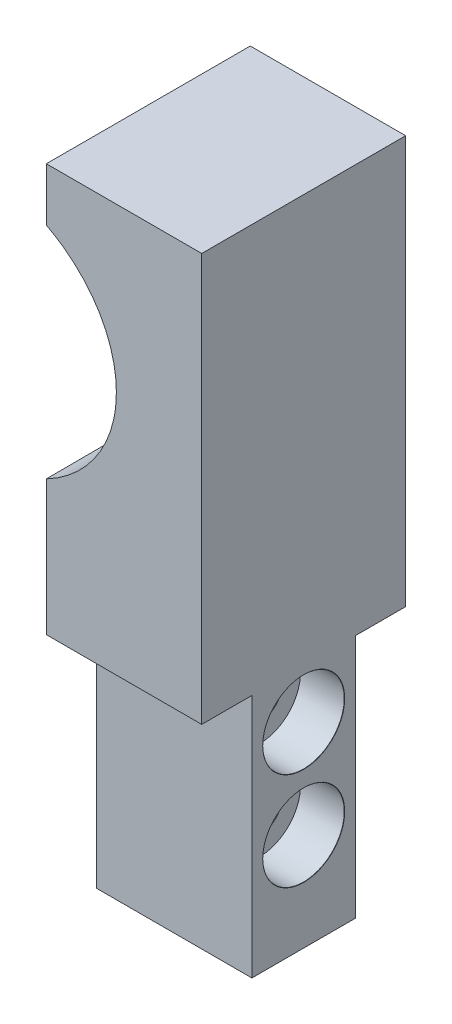
ISO-10303-21;
HEADER;
FILE_DESCRIPTION(('STEP AP214'),'2;1');
FILE_NAME('part.step','',(''),(''),'','','');
FILE_SCHEMA(('AUTOMOTIVE_DESIGN { 1 0 10303 214 1 1 1 1 }'));
ENDSEC;
DATA;
#1=APPLICATION_CONTEXT('core data for automotive mechanical design processes');
#2=APPLICATION_PROTOCOL_DEFINITION('international standard','automotive_design',2000,#1);
#3=PRODUCT_CONTEXT('',#1,'mechanical');
#4=PRODUCT('Part','Part','',(#3));
#5=PRODUCT_RELATED_PRODUCT_CATEGORY('part','',(#4));
#6=PRODUCT_DEFINITION_FORMATION('','',#4);
#7=PRODUCT_DEFINITION_CONTEXT('part definition',#1,'design');
#8=PRODUCT_DEFINITION('design','',#6,#7);
#9=PRODUCT_DEFINITION_SHAPE('','',#8);
#10=(LENGTH_UNIT() NAMED_UNIT(*) SI_UNIT(.MILLI.,.METRE.));
#11=(NAMED_UNIT(*) PLANE_ANGLE_UNIT() SI_UNIT($,.RADIAN.));
#12=(NAMED_UNIT(*) SI_UNIT($,.STERADIAN.) SOLID_ANGLE_UNIT());
#13=UNCERTAINTY_MEASURE_WITH_UNIT(LENGTH_MEASURE(1.E-05),#10,'distance_accuracy_value','');
#14=(GEOMETRIC_REPRESENTATION_CONTEXT(3) GLOBAL_UNCERTAINTY_ASSIGNED_CONTEXT((#13)) GLOBAL_UNIT_ASSIGNED_CONTEXT((#10,
#11,#12)) REPRESENTATION_CONTEXT('',''));
#15=CARTESIAN_POINT('',(0.,0.,0.));
#16=DIRECTION('',(0.,0.,1.));
#17=DIRECTION('',(1.,0.,0.));
#18=AXIS2_PLACEMENT_3D('',#15,#16,#17);
#19=CARTESIAN_POINT('',(-9.525,-40.,-12.5));
#20=DIRECTION('',(1.,0.,0.));
#21=DIRECTION('',(0.,0.,1.));
#22=AXIS2_PLACEMENT_3D('',#19,#20,#21);
#23=PLANE('',#22);
#24=CARTESIAN_POINT('',(-9.525,-28.0000000000013,0.));
#25=DIRECTION('',(-1.,0.,0.));
#26=DIRECTION('',(0.,0.,1.));
#27=AXIS2_PLACEMENT_3D('',#24,#25,#26);
#28=CIRCLE('',#27,2.775);
#29=CARTESIAN_POINT('',(-9.525,-28.0000000000013,2.775));
#30=VERTEX_POINT('',#29);
#31=EDGE_CURVE('E307',#30,#30,#28,.T.);
#32=ORIENTED_EDGE('',*,*,#31,.F.);
#33=EDGE_LOOP('',(#32));
#34=FACE_BOUND('',#33,.T.);
#35=CARTESIAN_POINT('',(-9.525,-16.000000000001,0.));
#36=DIRECTION('',(-1.,0.,0.));
#37=DIRECTION('',(0.,0.,1.));
#38=AXIS2_PLACEMENT_3D('',#35,#36,#37);
#39=CIRCLE('',#38,2.775);
#40=CARTESIAN_POINT('',(-9.525,-16.000000000001,2.775));
#41=VERTEX_POINT('',#40);
#42=EDGE_CURVE('E322',#41,#41,#39,.T.);
#43=ORIENTED_EDGE('',*,*,#42,.F.);
#44=EDGE_LOOP('',(#43));
#45=FACE_BOUND('',#44,.T.);
#46=DIRECTION('',(0.,0.,1.));
#47=VECTOR('',#46,1.);
#48=CARTESIAN_POINT('',(-9.525,-10.,-12.5));
#49=LINE('',#48,#47);
#50=CARTESIAN_POINT('',(-9.52499999999999,-10.,-12.5));
#51=VERTEX_POINT('',#50);
#52=CARTESIAN_POINT('',(-9.52499999999999,-10.,-6.35));
#53=VERTEX_POINT('',#52);
#54=EDGE_CURVE('E203',#51,#53,#49,.T.);
#55=ORIENTED_EDGE('',*,*,#54,.T.);
#56=DIRECTION('',(0.,-1.,0.));
#57=VECTOR('',#56,1.);
#58=CARTESIAN_POINT('',(-9.525,-40.,-6.35));
#59=LINE('',#58,#57);
#60=CARTESIAN_POINT('',(-9.52499999999999,-40.,-6.35));
#61=VERTEX_POINT('',#60);
#62=EDGE_CURVE('E209',#53,#61,#59,.T.);
#63=ORIENTED_EDGE('',*,*,#62,.T.);
#64=DIRECTION('',(0.,0.,1.));
#65=VECTOR('',#64,1.);
#66=CARTESIAN_POINT('',(-9.525,-40.,-12.5));
#67=LINE('',#66,#65);
#68=CARTESIAN_POINT('',(-9.525,-40.,6.35));
#69=VERTEX_POINT('',#68);
#70=EDGE_CURVE('E155',#61,#69,#67,.T.);
#71=ORIENTED_EDGE('',*,*,#70,.T.);
#72=DIRECTION('',(0.,1.,0.));
#73=VECTOR('',#72,1.);
#74=CARTESIAN_POINT('',(-9.525,-40.,6.35));
#75=LINE('',#74,#73);
#76=CARTESIAN_POINT('',(-9.525,-10.,6.35));
#77=VERTEX_POINT('',#76);
#78=EDGE_CURVE('E206',#69,#77,#75,.T.);
#79=ORIENTED_EDGE('',*,*,#78,.T.);
#80=DIRECTION('',(0.,0.,1.));
#81=VECTOR('',#80,1.);
#82=CARTESIAN_POINT('',(-9.525,-10.,-12.5));
#83=LINE('',#82,#81);
#84=CARTESIAN_POINT('',(-9.525,-10.,12.5));
#85=VERTEX_POINT('',#84);
#86=EDGE_CURVE('E132',#77,#85,#83,.T.);
#87=ORIENTED_EDGE('',*,*,#86,.T.);
#88=DIRECTION('',(0.,-1.,0.));
#89=VECTOR('',#88,1.);
#90=CARTESIAN_POINT('',(-9.525,-40.,12.5));
#91=LINE('',#90,#89);
#92=CARTESIAN_POINT('',(-9.525,6.54099273428371,12.5));
#93=VERTEX_POINT('',#92);
#94=EDGE_CURVE('E122',#93,#85,#91,.T.);
#95=ORIENTED_EDGE('',*,*,#94,.F.);
#96=CARTESIAN_POINT('',(-9.525,6.72222095627451,-12.5));
#97=CARTESIAN_POINT('',(-9.525,6.71044946372356,-11.4583607298308));
#98=CARTESIAN_POINT('',(-9.525,6.69864991705682,-10.416721590815));
#99=CARTESIAN_POINT('',(-9.525,6.67547977665558,-8.33344344918076));
#100=CARTESIAN_POINT('',(-9.525,6.6641091809145,-7.29180444658444));
#101=CARTESIAN_POINT('',(-9.525,6.64228193355523,-5.20852140588304));
#102=CARTESIAN_POINT('',(-9.525,6.63182527781304,-4.16687736782191));
#103=CARTESIAN_POINT('',(-9.525,6.61224422257049,-2.08357999321252));
#104=CARTESIAN_POINT('',(-9.525,6.60311981874511,-1.04192665670543));
#105=CARTESIAN_POINT('',(-9.525,6.58654696063964,1.04139645284193));
#106=CARTESIAN_POINT('',(-9.525,6.57909851110111,2.08306622592037));
#107=CARTESIAN_POINT('',(-9.525,6.56611648380159,4.16641874491652));
#108=CARTESIAN_POINT('',(-9.525,6.56058290772208,5.20810149084482));
#109=CARTESIAN_POINT('',(-9.525,6.55155696593248,7.29148028754577));
#110=CARTESIAN_POINT('',(-9.525,6.54806460897654,8.33317633835631));
#111=CARTESIAN_POINT('',(-9.525,6.54305942270401,10.4165814739288));
#112=CARTESIAN_POINT('',(-9.525,6.54154660908162,11.4582905587286));
#113=CARTESIAN_POINT('',(-9.52499999999999,6.54099273428371,12.5));
#114=B_SPLINE_CURVE_WITH_KNOTS('',3,(#96,#97,#98,#99,#100,#101,#102,#103,#104,#105,#106,#107,
#108,#109,#110,#111,#112,#113),.UNSPECIFIED.,.F.,.F.,(4,2,2,2,2,2,2,2,4),(0.,3.12511766809496,
6.25022071537157,9.37530966037829,12.5003884598771,15.6254761006678,18.7505664856318,
21.8756702730198,25.0007988366524),.UNSPECIFIED.);
#115=CARTESIAN_POINT('',(-9.525,6.72222095627451,-12.5));
#116=VERTEX_POINT('',#115);
#117=EDGE_CURVE('E211',#116,#93,#114,.T.);
#118=ORIENTED_EDGE('',*,*,#117,.F.);
#119=DIRECTION('',(0.,-1.,0.));
#120=VECTOR('',#119,1.);
#121=CARTESIAN_POINT('',(-9.525,-40.,-12.5));
#122=LINE('',#121,#120);
#123=EDGE_CURVE('E143',#116,#51,#122,.T.);
#124=ORIENTED_EDGE('',*,*,#123,.T.);
#125=EDGE_LOOP('',(#55,#63,#71,#79,#87,#95,#118,#124));
#126=FACE_BOUND('',#125,.T.);
#127=ADVANCED_FACE('F35',(#34,#45,#126),#23,.F.);
#128=CARTESIAN_POINT('',(9.525,-40.,-12.5));
#129=DIRECTION('',(0.,1.,0.));
#130=DIRECTION('',(0.,0.,-1.));
#131=AXIS2_PLACEMENT_3D('',#128,#129,#130);
#132=PLANE('',#131);
#133=DIRECTION('',(1.,0.,0.));
#134=VECTOR('',#133,1.);
#135=CARTESIAN_POINT('',(-119.913071807873,-40.,-6.35));
#136=LINE('',#135,#134);
#137=CARTESIAN_POINT('',(9.52499999999999,-40.,-6.35));
#138=VERTEX_POINT('',#137);
#139=EDGE_CURVE('E190',#61,#138,#136,.T.);
#140=ORIENTED_EDGE('',*,*,#139,.T.);
#141=DIRECTION('',(0.,0.,1.));
#142=VECTOR('',#141,1.);
#143=CARTESIAN_POINT('',(9.525,-40.,-12.5));
#144=LINE('',#143,#142);
#145=CARTESIAN_POINT('',(9.525,-40.,6.35));
#146=VERTEX_POINT('',#145);
#147=EDGE_CURVE('E153',#138,#146,#144,.T.);
#148=ORIENTED_EDGE('',*,*,#147,.T.);
#149=DIRECTION('',(1.,0.,0.));
#150=VECTOR('',#149,1.);
#151=CARTESIAN_POINT('',(-119.913071807873,-40.,6.35));
#152=LINE('',#151,#150);
#153=EDGE_CURVE('E58',#69,#146,#152,.T.);
#154=ORIENTED_EDGE('',*,*,#153,.F.);
#155=ORIENTED_EDGE('',*,*,#70,.F.);
#156=EDGE_LOOP('',(#140,#148,#154,#155));
#157=FACE_BOUND('',#156,.T.);
#158=ADVANCED_FACE('F182',(#157),#132,.F.);
#159=CARTESIAN_POINT('',(9.525,-40.,-12.5));
#160=DIRECTION('',(-1.,0.,0.));
#161=DIRECTION('',(0.,0.,-1.));
#162=AXIS2_PLACEMENT_3D('',#159,#160,#161);
#163=PLANE('',#162);
#164=CARTESIAN_POINT('',(9.525,-28.0000000000013,0.));
#165=DIRECTION('',(-1.,0.,0.));
#166=DIRECTION('',(0.,0.,1.));
#167=AXIS2_PLACEMENT_3D('',#164,#165,#166);
#168=CIRCLE('',#167,5.025);
#169=CARTESIAN_POINT('',(9.525,-28.0000000000013,5.025));
#170=VERTEX_POINT('',#169);
#171=EDGE_CURVE('E306',#170,#170,#168,.T.);
#172=ORIENTED_EDGE('',*,*,#171,.T.);
#173=EDGE_LOOP('',(#172));
#174=FACE_BOUND('',#173,.T.);
#175=CARTESIAN_POINT('',(9.525,-16.000000000001,0.));
#176=DIRECTION('',(-1.,0.,0.));
#177=DIRECTION('',(0.,0.,1.));
#178=AXIS2_PLACEMENT_3D('',#175,#176,#177);
#179=CIRCLE('',#178,5.025);
#180=CARTESIAN_POINT('',(9.525,-16.000000000001,5.025));
#181=VERTEX_POINT('',#180);
#182=EDGE_CURVE('E325',#181,#181,#179,.T.);
#183=ORIENTED_EDGE('',*,*,#182,.T.);
#184=EDGE_LOOP('',(#183));
#185=FACE_BOUND('',#184,.T.);
#186=DIRECTION('',(0.,0.,-1.));
#187=VECTOR('',#186,1.);
#188=CARTESIAN_POINT('',(9.525,-10.,-12.5));
#189=LINE('',#188,#187);
#190=CARTESIAN_POINT('',(9.52499999999999,-10.,-6.35));
#191=VERTEX_POINT('',#190);
#192=CARTESIAN_POINT('',(9.525,-10.,-12.5));
#193=VERTEX_POINT('',#192);
#194=EDGE_CURVE('E201',#191,#193,#189,.T.);
#195=ORIENTED_EDGE('',*,*,#194,.T.);
#196=DIRECTION('',(0.,1.,0.));
#197=VECTOR('',#196,1.);
#198=CARTESIAN_POINT('',(9.525,-40.,-12.5));
#199=LINE('',#198,#197);
#200=CARTESIAN_POINT('',(9.525,40.,-12.5));
#201=VERTEX_POINT('',#200);
#202=EDGE_CURVE('E231',#193,#201,#199,.T.);
#203=ORIENTED_EDGE('',*,*,#202,.T.);
#204=DIRECTION('',(0.,0.,1.));
#205=VECTOR('',#204,1.);
#206=CARTESIAN_POINT('',(9.525,40.,-12.5));
#207=LINE('',#206,#205);
#208=CARTESIAN_POINT('',(9.525,40.,12.5));
#209=VERTEX_POINT('',#208);
#210=EDGE_CURVE('E139',#201,#209,#207,.T.);
#211=ORIENTED_EDGE('',*,*,#210,.T.);
#212=DIRECTION('',(0.,1.,0.));
#213=VECTOR('',#212,1.);
#214=CARTESIAN_POINT('',(9.525,-40.,12.5));
#215=LINE('',#214,#213);
#216=CARTESIAN_POINT('',(9.52499999999999,-10.,12.5));
#217=VERTEX_POINT('',#216);
#218=EDGE_CURVE('E119',#217,#209,#215,.T.);
#219=ORIENTED_EDGE('',*,*,#218,.F.);
#220=DIRECTION('',(0.,0.,-1.));
#221=VECTOR('',#220,1.);
#222=CARTESIAN_POINT('',(9.525,-10.,-12.5));
#223=LINE('',#222,#221);
#224=CARTESIAN_POINT('',(9.525,-10.,6.35));
#225=VERTEX_POINT('',#224);
#226=EDGE_CURVE('E129',#217,#225,#223,.T.);
#227=ORIENTED_EDGE('',*,*,#226,.T.);
#228=DIRECTION('',(0.,-1.,0.));
#229=VECTOR('',#228,1.);
#230=CARTESIAN_POINT('',(9.525,-40.,6.35));
#231=LINE('',#230,#229);
#232=EDGE_CURVE('E43',#225,#146,#231,.T.);
#233=ORIENTED_EDGE('',*,*,#232,.T.);
#234=ORIENTED_EDGE('',*,*,#147,.F.);
#235=DIRECTION('',(0.,1.,0.));
#236=VECTOR('',#235,1.);
#237=CARTESIAN_POINT('',(9.525,-40.,-6.35));
#238=LINE('',#237,#236);
#239=EDGE_CURVE('E11',#138,#191,#238,.T.);
#240=ORIENTED_EDGE('',*,*,#239,.T.);
#241=EDGE_LOOP('',(#195,#203,#211,#219,#227,#233,#234,#240));
#242=FACE_BOUND('',#241,.T.);
#243=ADVANCED_FACE('F136',(#174,#185,#242),#163,.F.);
#244=CARTESIAN_POINT('',(0.,0.,-12.5));
#245=DIRECTION('',(0.,0.,-1.));
#246=DIRECTION('',(1.,0.,0.));
#247=AXIS2_PLACEMENT_3D('',#244,#245,#246);
#248=PLANE('',#247);
#249=ORIENTED_EDGE('',*,*,#123,.F.);
#250=CARTESIAN_POINT('',(-9.525,6.72222095627451,-12.5));
#251=CARTESIAN_POINT('',(-9.21805080581185,6.83072119180028,-12.5));
#252=CARTESIAN_POINT('',(-8.91338752306544,6.94559211631219,-12.5));
#253=CARTESIAN_POINT('',(-8.30920915966031,7.18831132711993,-12.5));
#254=CARTESIAN_POINT('',(-8.00969509721073,7.31616214632383,-12.5));
#255=CARTESIAN_POINT('',(-7.11827899048494,7.72021531132789,-12.5));
#256=CARTESIAN_POINT('',(-6.53520939834011,8.01632028501955,-12.5));
#257=CARTESIAN_POINT('',(-5.39305592737399,8.66667358233564,-12.5));
#258=CARTESIAN_POINT('',(-4.83434657890416,9.02158066315018,-12.5));
#259=CARTESIAN_POINT('',(-3.75790776170834,9.78802601082818,-12.5));
#260=CARTESIAN_POINT('',(-3.24012000018284,10.1994813479225,-12.5));
#261=CARTESIAN_POINT('',(-2.45734713336035,10.8998320505548,-12.5));
#262=CARTESIAN_POINT('',(-2.17554176385463,11.1700759727283,-12.5));
#263=CARTESIAN_POINT('',(-1.63258402166547,11.7306697183082,-12.5));
#264=CARTESIAN_POINT('',(-1.37143087443081,12.0210187869142,-12.5));
#265=CARTESIAN_POINT('',(-0.873906425132995,12.6201619288629,-12.5));
#266=CARTESIAN_POINT('',(-0.637433303049706,12.928871239455,-12.5));
#267=CARTESIAN_POINT('',(-0.191269615004358,13.5651034551949,-12.5));
#268=CARTESIAN_POINT('',(0.0184249725546636,13.8926235246091,-12.5));
#269=CARTESIAN_POINT('',(0.378395338468959,14.5146854220897,-12.5));
#270=CARTESIAN_POINT('',(0.532865653173015,14.8068018586106,-12.5));
#271=CARTESIAN_POINT('',(0.817886613990662,15.4024958995602,-12.5));
#272=CARTESIAN_POINT('',(0.948439454719922,15.7060724493477,-12.5));
#273=CARTESIAN_POINT('',(1.18371193070062,16.3232581954752,-12.5));
#274=CARTESIAN_POINT('',(1.2884202072697,16.6368717349109,-12.5));
#275=CARTESIAN_POINT('',(1.47024093454254,17.2720218646805,-12.5));
#276=CARTESIAN_POINT('',(1.54735356588438,17.5935584031367,-12.5));
#277=CARTESIAN_POINT('',(1.67295553445598,18.2433622625507,-12.5));
#278=CARTESIAN_POINT('',(1.72134334164109,18.5716492644054,-12.5));
#279=CARTESIAN_POINT('',(1.78843363623957,19.2312610930933,-12.5));
#280=CARTESIAN_POINT('',(1.8071343824309,19.5625860969667,-12.5));
#281=CARTESIAN_POINT('',(1.81479702435803,20.2255161767849,-12.5));
#282=CARTESIAN_POINT('',(1.80376480838523,20.557121184276,-12.5));
#283=CARTESIAN_POINT('',(1.75176811486442,21.2179536843975,-12.5));
#284=CARTESIAN_POINT('',(1.71080658708871,21.5471814080991,-12.5));
#285=CARTESIAN_POINT('',(1.60302225725592,22.1800128600585,-12.5));
#286=CARTESIAN_POINT('',(1.53799147164527,22.4839241032373,-12.5));
#287=CARTESIAN_POINT('',(1.38308591542175,23.085326350044,-12.5));
#288=CARTESIAN_POINT('',(1.29321183528363,23.3828175318583,-12.5));
#289=CARTESIAN_POINT('',(1.08994504300596,23.9696082757396,-12.5));
#290=CARTESIAN_POINT('',(0.976553750771852,24.2589083311667,-12.5));
#291=CARTESIAN_POINT('',(0.727828891299855,24.8278999627546,-12.5));
#292=CARTESIAN_POINT('',(0.592494268040126,25.1075910757,-12.5));
#293=CARTESIAN_POINT('',(0.29408301934079,25.670417708831,-12.5));
#294=CARTESIAN_POINT('',(0.129934079658332,25.9529841153122,-12.5));
#295=CARTESIAN_POINT('',(-0.218644579022574,26.5052456953524,-12.5));
#296=CARTESIAN_POINT('',(-0.403074499909266,26.7749407407443,-12.5));
#297=CARTESIAN_POINT('',(-0.983926097061353,27.5639551342926,-12.5));
#298=CARTESIAN_POINT('',(-1.40787570646753,28.0631411207627,-12.5));
#299=CARTESIAN_POINT('',(-2.55485843761487,29.2549955408907,-12.5));
#300=CARTESIAN_POINT('',(-3.31728498758254,29.9099137883429,-12.5));
#301=CARTESIAN_POINT('',(-4.53142224559892,30.7932788084099,-12.5));
#302=CARTESIAN_POINT('',(-4.94855084640193,31.071568295999,-12.5));
#303=CARTESIAN_POINT('',(-5.80265521219824,31.5957984074071,-12.5));
#304=CARTESIAN_POINT('',(-6.23962436272843,31.8417497071727,-12.5));
#305=CARTESIAN_POINT('',(-7.1441551686403,32.3092948539898,-12.5));
#306=CARTESIAN_POINT('',(-7.61224867026686,32.5298520564716,-12.5));
#307=CARTESIAN_POINT('',(-8.56011305721117,32.9367924193437,-12.5));
#308=CARTESIAN_POINT('',(-9.03980788884359,33.1233524442192,-12.5));
#309=CARTESIAN_POINT('',(-9.52499999999999,33.2939149851635,-12.5));
#310=B_SPLINE_CURVE_WITH_KNOTS('',3,(#250,#251,#252,#253,#254,#255,#256,#257,#258,#259,#260,
#261,#262,#263,#264,#265,#266,#267,#268,#269,#270,#271,#272,#273,#274,#275,#276,#277,#278,#279,
#280,#281,#282,#283,#284,#285,#286,#287,#288,#289,#290,#291,#292,#293,#294,#295,#296,#297,#298,
#299,#300,#301,#302,#303,#304,#305,#306,#307,#308,#309),.UNSPECIFIED.,.F.,.F.,(4,2,2,2,2,2,2,2,
2,2,2,2,2,2,2,2,2,2,2,2,2,2,2,2,2,2,2,2,2,4),(0.,0.976538725504387,1.95326838126283,
3.91213370971522,5.89464657528248,7.87428244691395,9.04471170940681,10.2150970546996,
11.3804452345237,12.5456181961711,13.5359629944833,14.5262168753356,15.5169052007618,
16.507587041132,17.5017499875976,18.4959712421081,19.4899956163271,20.4839220347311,
21.4152253261968,22.3465027363625,23.2777239348866,24.2089899616989,25.1883880361897,
26.1677958610401,28.1268231204905,31.1245697295819,32.6278780147176,34.1306887533155,
35.6817898527653,37.2245756781611),.UNSPECIFIED.);
#311=CARTESIAN_POINT('',(-9.525,33.2939149851635,-12.5));
#312=VERTEX_POINT('',#311);
#313=EDGE_CURVE('E222',#116,#312,#310,.T.);
#314=ORIENTED_EDGE('',*,*,#313,.T.);
#315=CARTESIAN_POINT('',(-9.525,40.,-12.5));
#316=VERTEX_POINT('',#315);
#317=EDGE_CURVE('E228',#316,#312,#122,.T.);
#318=ORIENTED_EDGE('',*,*,#317,.F.);
#319=DIRECTION('',(-1.,0.,0.));
#320=VECTOR('',#319,1.);
#321=CARTESIAN_POINT('',(9.525,40.,-12.5));
#322=LINE('',#321,#320);
#323=EDGE_CURVE('E151',#201,#316,#322,.T.);
#324=ORIENTED_EDGE('',*,*,#323,.F.);
#325=ORIENTED_EDGE('',*,*,#202,.F.);
#326=DIRECTION('',(1.,0.,0.));
#327=VECTOR('',#326,1.);
#328=CARTESIAN_POINT('',(0.,-10.,-12.5));
#329=LINE('',#328,#327);
#330=EDGE_CURVE('E125',#51,#193,#329,.T.);
#331=ORIENTED_EDGE('',*,*,#330,.F.);
#332=EDGE_LOOP('',(#249,#314,#318,#324,#325,#331));
#333=FACE_BOUND('',#332,.T.);
#334=ADVANCED_FACE('F175',(#333),#248,.T.);
#335=CARTESIAN_POINT('',(0.,0.,12.5));
#336=DIRECTION('',(0.,0.,-1.));
#337=DIRECTION('',(1.,0.,0.));
#338=AXIS2_PLACEMENT_3D('',#335,#336,#337);
#339=PLANE('',#338);
#340=DIRECTION('',(1.,0.,0.));
#341=VECTOR('',#340,1.);
#342=CARTESIAN_POINT('',(0.,-10.,12.5));
#343=LINE('',#342,#341);
#344=EDGE_CURVE('E114',#85,#217,#343,.T.);
#345=ORIENTED_EDGE('',*,*,#344,.T.);
#346=ORIENTED_EDGE('',*,*,#218,.T.);
#347=DIRECTION('',(-1.,0.,0.));
#348=VECTOR('',#347,1.);
#349=CARTESIAN_POINT('',(9.525,40.,12.5));
#350=LINE('',#349,#348);
#351=CARTESIAN_POINT('',(-9.525,40.,12.5));
#352=VERTEX_POINT('',#351);
#353=EDGE_CURVE('E140',#209,#352,#350,.T.);
#354=ORIENTED_EDGE('',*,*,#353,.T.);
#355=CARTESIAN_POINT('',(-9.525,33.480616326543,12.5));
#356=VERTEX_POINT('',#355);
#357=EDGE_CURVE('E141',#352,#356,#91,.T.);
#358=ORIENTED_EDGE('',*,*,#357,.T.);
#359=CARTESIAN_POINT('',(-9.525,6.54099273428371,12.5));
#360=CARTESIAN_POINT('',(-9.25028814049046,6.68493297073337,12.5));
#361=CARTESIAN_POINT('',(-8.97937324841624,6.83614212991723,12.5));
#362=CARTESIAN_POINT('',(-8.44589222508097,7.15286342247145,12.5));
#363=CARTESIAN_POINT('',(-8.18332948459029,7.31838126595022,12.5));
#364=CARTESIAN_POINT('',(-7.66749806468148,7.66339002019703,12.5));
#365=CARTESIAN_POINT('',(-7.41423051299943,7.84288261825627,12.5));
#366=CARTESIAN_POINT('',(-6.91680406128096,8.21630121216811,12.5));
#367=CARTESIAN_POINT('',(-6.67269058472896,8.4102877405848,12.5));
#368=CARTESIAN_POINT('',(-6.19569780578665,8.81157532689327,12.5));
#369=CARTESIAN_POINT('',(-5.96281724205746,9.0188748837477,12.5));
#370=CARTESIAN_POINT('',(-5.50920669885504,9.44633962710104,12.5));
#371=CARTESIAN_POINT('',(-5.28847647990815,9.66650455985715,12.5));
#372=CARTESIAN_POINT('',(-4.7520838186808,10.2333600462474,12.5));
#373=CARTESIAN_POINT('',(-4.44464210395124,10.587895921408,12.5));
#374=CARTESIAN_POINT('',(-3.86255382958281,11.3230487741627,12.5));
#375=CARTESIAN_POINT('',(-3.58790895434042,11.7036670897332,12.5));
#376=CARTESIAN_POINT('',(-3.20328456546636,12.2917954804159,12.5));
#377=CARTESIAN_POINT('',(-3.07972747520181,12.4905280531789,12.5));
#378=CARTESIAN_POINT('',(-2.84200470851735,12.8934527537923,12.5));
#379=CARTESIAN_POINT('',(-2.72783635297583,13.0976433019908,12.5));
#380=CARTESIAN_POINT('',(-2.39993181697622,13.7179543375883,12.5));
#381=CARTESIAN_POINT('',(-2.20073858728331,14.1419020544187,12.5));
#382=CARTESIAN_POINT('',(-1.85762266167575,14.974086461254,12.5));
#383=CARTESIAN_POINT('',(-1.71065280854245,15.3810740391131,12.5));
#384=CARTESIAN_POINT('',(-1.45408443810126,16.2066560122606,12.5));
#385=CARTESIAN_POINT('',(-1.34448313070708,16.6252495384775,12.5));
#386=CARTESIAN_POINT('',(-1.16388517250773,17.4709149259753,12.5));
#387=CARTESIAN_POINT('',(-1.09290295960301,17.8979898963157,12.5));
#388=CARTESIAN_POINT('',(-1.01588875277082,18.5419904369619,12.5));
#389=CARTESIAN_POINT('',(-0.99512634912585,18.7572526997705,12.5));
#390=CARTESIAN_POINT('',(-0.963419037870426,19.1885140451753,12.5));
#391=CARTESIAN_POINT('',(-0.952474064080938,19.404513122795,12.5));
#392=CARTESIAN_POINT('',(-0.940782072550416,19.821567529849,12.5));
#393=CARTESIAN_POINT('',(-0.939371522750139,20.0226046572122,12.5));
#394=CARTESIAN_POINT('',(-0.944990631806713,20.4245458043823,12.5));
#395=CARTESIAN_POINT('',(-0.952020130263878,20.6254498266461,12.5));
#396=CARTESIAN_POINT('',(-0.985866960400391,21.227395582535,12.5));
#397=CARTESIAN_POINT('',(-1.02543895004101,21.6278002541691,12.5));
#398=CARTESIAN_POINT('',(-1.13848728339257,22.4235282964576,12.5));
#399=CARTESIAN_POINT('',(-1.2119459907546,22.8188542004848,12.5));
#400=CARTESIAN_POINT('',(-1.39215105564504,23.6018632183971,12.5));
#401=CARTESIAN_POINT('',(-1.49889814702686,23.9895461635903,12.5));
#402=CARTESIAN_POINT('',(-1.74394539501243,24.7525243321268,12.5));
#403=CARTESIAN_POINT('',(-1.88207544027299,25.1278742903812,12.5));
#404=CARTESIAN_POINT('',(-2.18876529307308,25.8659127747244,12.5));
#405=CARTESIAN_POINT('',(-2.35732507213675,26.2286013126614,12.5));
#406=CARTESIAN_POINT('',(-2.72324888616666,26.9393168789571,12.5));
#407=CARTESIAN_POINT('',(-2.92062498966228,27.2873376852552,12.5));
#408=CARTESIAN_POINT('',(-3.34224719695499,27.9666822206617,12.5));
#409=CARTESIAN_POINT('',(-3.56649364715569,28.2980057344359,12.5));
#410=CARTESIAN_POINT('',(-4.04969943529811,28.9557057927591,12.5));
#411=CARTESIAN_POINT('',(-4.30971236794156,29.2813079896426,12.5));
#412=CARTESIAN_POINT('',(-4.85448103317099,29.9111193601039,12.5));
#413=CARTESIAN_POINT('',(-5.13923864746459,30.2153269035385,12.5));
#414=CARTESIAN_POINT('',(-5.73114319889258,30.8009450246394,12.5));
#415=CARTESIAN_POINT('',(-6.03828471904836,31.0823610833439,12.5));
#416=CARTESIAN_POINT('',(-6.67270269106074,31.6212978661661,12.5));
#417=CARTESIAN_POINT('',(-6.99997392795881,31.8788247361986,12.5));
#418=CARTESIAN_POINT('',(-7.68381266750846,32.3773318564232,12.5));
#419=CARTESIAN_POINT('',(-8.04099421809497,32.6174692291263,12.5));
#420=CARTESIAN_POINT('',(-8.77139363796429,33.0699020594326,12.5));
#421=CARTESIAN_POINT('',(-9.14457087698095,33.2822630833306,12.5));
#422=CARTESIAN_POINT('',(-9.52499999999999,33.480616326543,12.5));
#423=B_SPLINE_CURVE_WITH_KNOTS('',3,(#359,#360,#361,#362,#363,#364,#365,#366,#367,#368,#369,
#370,#371,#372,#373,#374,#375,#376,#377,#378,#379,#380,#381,#382,#383,#384,#385,#386,#387,#388,
#389,#390,#391,#392,#393,#394,#395,#396,#397,#398,#399,#400,#401,#402,#403,#404,#405,#406,#407,
#408,#409,#410,#411,#412,#413,#414,#415,#416,#417,#418,#419,#420,#421,#422),.UNSPECIFIED.,.F.,
.F.,(4,2,2,2,2,2,2,2,2,2,2,2,2,2,2,2,2,2,2,2,2,2,2,2,2,2,2,2,2,2,2,4),(0.,0.930320528127219,
1.86101404461703,2.7918201064482,3.72675798469723,4.66159063360699,5.59640485110572,
7.00234755877959,8.40836244253576,9.11017217041135,9.81178093345414,11.214684606059,
12.5111281717938,13.8074749186161,15.1043059773305,15.7529052993054,16.4015002490569,
17.0044460271065,17.6073803465978,18.8128623227475,20.0177176121762,21.2225994649153,
22.4210998096168,23.6195990327789,24.8186016455113,26.0176197170518,27.2663388644523,
28.5151530538532,29.7636660233131,31.0118568947863,32.3018457700838,33.5887324420961),.UNSPECIFIED.);
#424=EDGE_CURVE('E126',#93,#356,#423,.T.);
#425=ORIENTED_EDGE('',*,*,#424,.F.);
#426=ORIENTED_EDGE('',*,*,#94,.T.);
#427=EDGE_LOOP('',(#345,#346,#354,#358,#425,#426));
#428=FACE_BOUND('',#427,.T.);
#429=ADVANCED_FACE('F116',(#428),#339,.F.);
#430=ORIENTED_EDGE('',*,*,#357,.F.);
#431=DIRECTION('',(0.,0.,1.));
#432=VECTOR('',#431,1.);
#433=CARTESIAN_POINT('',(-9.525,40.,-12.5));
#434=LINE('',#433,#432);
#435=EDGE_CURVE('E149',#316,#352,#434,.T.);
#436=ORIENTED_EDGE('',*,*,#435,.F.);
#437=ORIENTED_EDGE('',*,*,#317,.T.);
#438=CARTESIAN_POINT('',(-9.525,33.480616326543,12.5));
#439=CARTESIAN_POINT('',(-9.525,33.4811196153101,11.4582824233824));
#440=CARTESIAN_POINT('',(-9.525,33.4805058274103,10.4165640538078));
#441=CARTESIAN_POINT('',(-9.525,33.4769550447271,8.33314292957974));
#442=CARTESIAN_POINT('',(-9.525,33.4740180758636,7.29144017488165));
#443=CARTESIAN_POINT('',(-9.525,33.4657319182961,5.20805061966195));
#444=CARTESIAN_POINT('',(-9.525,33.460382744374,4.1663638190817));
#445=CARTESIAN_POINT('',(-9.525,33.4474115143532,2.08300593068715));
#446=CARTESIAN_POINT('',(-9.525,33.4397894612872,1.04133484285376));
#447=CARTESIAN_POINT('',(-9.525,33.422546314921,-1.04198654073165));
#448=CARTESIAN_POINT('',(-9.525,33.4129252293554,-2.08363683654851));
#449=CARTESIAN_POINT('',(-9.525,33.3920814675334,-4.16692594934694));
#450=CARTESIAN_POINT('',(-9.525,33.3808587839509,-5.20856476625421));
#451=CARTESIAN_POINT('',(-9.525,33.3572956483226,-7.29183622593584));
#452=CARTESIAN_POINT('',(-9.525,33.3449551890906,-8.33346886862744));
#453=CARTESIAN_POINT('',(-9.525,33.3197149456739,-10.4167344375449));
#454=CARTESIAN_POINT('',(-9.52499999999999,33.306815157726,-11.4583673637256));
#455=CARTESIAN_POINT('',(-9.52499999999998,33.2939149851635,-12.5));
#456=B_SPLINE_CURVE_WITH_KNOTS('',3,(#438,#439,#440,#441,#442,#443,#444,#445,#446,#447,#448,
#449,#450,#451,#452,#453,#454,#455),.UNSPECIFIED.,.F.,.F.,(4,2,2,2,2,2,2,2,4),(0.,
3.12515288849737,6.25027090999449,9.37536978133799,12.5004644830165,15.6255470933074,
18.7506439987546,21.8757609967148,25.0008990236509),.UNSPECIFIED.);
#457=EDGE_CURVE('E217',#356,#312,#456,.T.);
#458=ORIENTED_EDGE('',*,*,#457,.F.);
#459=EDGE_LOOP('',(#430,#436,#437,#458));
#460=FACE_BOUND('',#459,.T.);
#461=ADVANCED_FACE('F174',(#460),#23,.F.);
#462=CARTESIAN_POINT('',(9.525,40.,-12.5));
#463=DIRECTION('',(0.,-1.,0.));
#464=DIRECTION('',(0.,0.,1.));
#465=AXIS2_PLACEMENT_3D('',#462,#463,#464);
#466=PLANE('',#465);
#467=ORIENTED_EDGE('',*,*,#353,.F.);
#468=ORIENTED_EDGE('',*,*,#210,.F.);
#469=ORIENTED_EDGE('',*,*,#323,.T.);
#470=ORIENTED_EDGE('',*,*,#435,.T.);
#471=EDGE_LOOP('',(#467,#468,#469,#470));
#472=FACE_BOUND('',#471,.T.);
#473=ADVANCED_FACE('F177',(#472),#466,.F.);
#474=CARTESIAN_POINT('',(-18.0249510310583,35.8874248328034,33.4234406330911));
#475=CARTESIAN_POINT('',(-18.0249510310583,35.8874248328034,11.2087548077827));
#476=CARTESIAN_POINT('',(-17.6156980728582,34.3472028128824,-10.9868735416004));
#477=CARTESIAN_POINT('',(-17.6156980728582,34.3472028128824,-33.2015593669089));
#478=CARTESIAN_POINT('',(-18.463378517066,35.8874248328034,33.4234406330911));
#479=CARTESIAN_POINT('',(-18.463378517066,35.8874248328034,11.209101468776));
#480=CARTESIAN_POINT('',(-18.1954437886055,34.3549155443624,-10.9872202025937));
#481=CARTESIAN_POINT('',(-18.1954437886055,34.3549155443624,-33.2015593669089));
#482=CARTESIAN_POINT('',(-19.3319854918797,35.8518300814042,33.4234406330911));
#483=CARTESIAN_POINT('',(-19.3319854918798,35.8518300814042,11.2095225116709));
#484=CARTESIAN_POINT('',(-19.344945548415,34.3380519105953,-10.9876412454886));
#485=CARTESIAN_POINT('',(-19.344945548415,34.3380519105953,-33.2015593669089));
#486=CARTESIAN_POINT('',(-20.6060499493662,35.6957557132373,33.4234406330911));
#487=CARTESIAN_POINT('',(-20.6060499493662,35.6957557132373,11.2093422663976));
#488=CARTESIAN_POINT('',(-21.0336992934804,34.2195213492577,-10.9874610002154));
#489=CARTESIAN_POINT('',(-21.0336992934804,34.2195213492577,-33.2015593669089));
#490=CARTESIAN_POINT('',(-21.8471663889887,35.441101117132,33.4234406330911));
#491=CARTESIAN_POINT('',(-21.8471663889887,35.441101117132,11.2083860107361));
#492=CARTESIAN_POINT('',(-22.6814242643044,34.0113878567276,-10.9865047445538));
#493=CARTESIAN_POINT('',(-22.6814242643044,34.0113878567276,-33.2015593669089));
#494=CARTESIAN_POINT('',(-29.0715648407625,33.3463042516479,33.4234406330911));
#495=CARTESIAN_POINT('',(-29.0715648407625,33.3463042516479,11.1984954265869));
#496=CARTESIAN_POINT('',(-32.2884221662427,32.2467623913572,-10.976614160405));
#497=CARTESIAN_POINT('',(-32.2884221662427,32.2467623913572,-33.2015593669089));
#498=CARTESIAN_POINT('',(-33.9124510310583,27.014764608926,33.4234406330911));
#499=CARTESIAN_POINT('',(-33.9124510310583,27.014764608926,11.1520034898647));
#500=CARTESIAN_POINT('',(-38.8527669357851,26.6141971129115,-10.9301222236825));
#501=CARTESIAN_POINT('',(-38.8527669357851,26.6141971129115,-33.2015593669089));
#502=CARTESIAN_POINT('',(-33.9124510310583,11.2313751126502,33.4234406330911));
#503=CARTESIAN_POINT('',(-33.9124510310583,11.2313751126502,11.1461593827908));
#504=CARTESIAN_POINT('',(-39.25933806666,12.360936589171,-10.9242781166083));
#505=CARTESIAN_POINT('',(-39.25933806666,12.360936589171,-33.2015593669089));
#506=CARTESIAN_POINT('',(-26.7935007512116,4.11242483280345,33.4234406330911));
#507=CARTESIAN_POINT('',(-26.7935007512116,4.11242483280345,11.2072247441281));
#508=CARTESIAN_POINT('',(-30.0291183042061,5.80690148232474,-10.9853434779458));
#509=CARTESIAN_POINT('',(-30.0291183042061,5.80690148232474,-33.2015593669089));
#510=CARTESIAN_POINT('',(-9.25640131090505,4.11242483280345,33.4234406330911));
#511=CARTESIAN_POINT('',(-9.25640131090505,4.11242483280345,11.2102848714373));
#512=CARTESIAN_POINT('',(-6.83928967431076,5.49839222312423,-10.988403605255));
#513=CARTESIAN_POINT('',(-6.83928967431076,5.49839222312423,-33.2015593669089));
#514=CARTESIAN_POINT('',(-2.1374510310583,11.2313751126502,33.4234406330911));
#515=CARTESIAN_POINT('',(-2.1374510310583,11.2313751126502,11.1522796374091));
#516=CARTESIAN_POINT('',(2.75769030357124,11.8019569389464,-10.930398371227));
#517=CARTESIAN_POINT('',(2.75769030357123,11.8019569389464,-33.2015593669089));
#518=CARTESIAN_POINT('',(-2.1374510310583,27.014764608926,33.4234406330911));
#519=CARTESIAN_POINT('',(-2.1374510310583,27.014764608926,11.14710728617));
#520=CARTESIAN_POINT('',(3.1642614344462,26.055217462687,-10.9252260199878));
#521=CARTESIAN_POINT('',(3.16426143444619,26.055217462687,-33.2015593669089));
#522=CARTESIAN_POINT('',(-6.97833722135408,33.3463042516479,33.4234406330911));
#523=CARTESIAN_POINT('',(-6.97833722135408,33.3463042516479,11.182154346756));
#524=CARTESIAN_POINT('',(-3.07388961943981,31.858102607029,-10.9602730805736));
#525=CARTESIAN_POINT('',(-3.07388961943981,31.858102607029,-33.2015593669089));
#526=CARTESIAN_POINT('',(-14.2027356731279,35.441101117132,33.4234406330911));
#527=CARTESIAN_POINT('',(-14.2027356731279,35.441101117132,11.2024761134811));
#528=CARTESIAN_POINT('',(-12.5729659712251,33.8769085110873,-10.9805948472988));
#529=CARTESIAN_POINT('',(-12.5729659712251,33.8769085110873,-33.2015593669089));
#530=CARTESIAN_POINT('',(-15.4438521127504,35.6957557132373,33.4234406330911));
#531=CARTESIAN_POINT('',(-15.4438521127504,35.6957557132373,11.20527536882));
#532=CARTESIAN_POINT('',(-14.2075714271128,34.1287089640146,-10.9833941026377));
#533=CARTESIAN_POINT('',(-14.2075714271128,34.1287089640146,-33.2015593669089));
#534=CARTESIAN_POINT('',(-16.7179165702368,35.8518300814042,33.4234406330911));
#535=CARTESIAN_POINT('',(-16.7179165702368,35.8518300814042,11.2074425457111));
#536=CARTESIAN_POINT('',(-15.8882843983785,34.2920657160561,-10.9855612795288));
#537=CARTESIAN_POINT('',(-15.8882843983785,34.2920657160561,-33.2015593669089));
#538=CARTESIAN_POINT('',(-17.5865235450506,35.8874248328034,33.4234406330911));
#539=CARTESIAN_POINT('',(-17.5865235450506,35.8874248328034,11.2084081467894));
#540=CARTESIAN_POINT('',(-17.0359523571108,34.3394900814024,-10.9865268806071));
#541=CARTESIAN_POINT('',(-17.0359523571108,34.3394900814024,-33.2015593669089));
#542=CARTESIAN_POINT('',(-18.0249510310583,35.8874248328034,33.4234406330911));
#543=CARTESIAN_POINT('',(-18.0249510310583,35.8874248328034,11.2087548077827));
#544=CARTESIAN_POINT('',(-17.6156980728582,34.3472028128824,-10.9868735416004));
#545=CARTESIAN_POINT('',(-17.6156980728582,34.3472028128824,-33.2015593669089));
#546=B_SPLINE_SURFACE_WITH_KNOTS('',3,3,((#474,#475,#476,#477),(#478,#479,#480,#481),(#482,#483,
#484,#485),(#486,#487,#488,#489),(#490,#491,#492,#493),(#494,#495,#496,#497),(#498,#499,#500,
#501),(#502,#503,#504,#505),(#506,#507,#508,#509),(#510,#511,#512,#513),(#514,#515,#516,#517),
(#518,#519,#520,#521),(#522,#523,#524,#525),(#526,#527,#528,#529),(#530,#531,#532,#533),(#534,
#535,#536,#537),(#538,#539,#540,#541),(#542,#543,#544,#545)),.UNSPECIFIED.,.T.,.F.,.F.,(4,1,1,1,
1,2,2,2,1,1,1,1,4),(4,4),(0.,0.0125,0.0249999999999999,0.0375000000000001,0.05,0.25,0.5,0.75,
0.95,0.9625,0.975,0.9875,1.),(0.,1.),.UNSPECIFIED.);
#547=ORIENTED_EDGE('',*,*,#313,.F.);
#548=ORIENTED_EDGE('',*,*,#117,.T.);
#549=ORIENTED_EDGE('',*,*,#424,.T.);
#550=ORIENTED_EDGE('',*,*,#457,.T.);
#551=EDGE_LOOP('',(#547,#548,#549,#550));
#552=FACE_BOUND('',#551,.T.);
#553=ADVANCED_FACE('F165',(#552),#546,.T.);
#554=CARTESIAN_POINT('',(-119.913071807873,-10.,6.35));
#555=DIRECTION('',(0.,-1.,0.));
#556=DIRECTION('',(0.,0.,1.));
#557=AXIS2_PLACEMENT_3D('',#554,#555,#556);
#558=PLANE('',#557);
#559=DIRECTION('',(1.,0.,0.));
#560=VECTOR('',#559,1.);
#561=CARTESIAN_POINT('',(-119.913071807873,-10.,6.35));
#562=LINE('',#561,#560);
#563=EDGE_CURVE('E50',#77,#225,#562,.T.);
#564=ORIENTED_EDGE('',*,*,#563,.T.);
#565=ORIENTED_EDGE('',*,*,#226,.F.);
#566=ORIENTED_EDGE('',*,*,#344,.F.);
#567=ORIENTED_EDGE('',*,*,#86,.F.);
#568=EDGE_LOOP('',(#564,#565,#566,#567));
#569=FACE_BOUND('',#568,.T.);
#570=ADVANCED_FACE('F130',(#569),#558,.T.);
#571=CARTESIAN_POINT('',(-119.913071807873,-40.,6.35));
#572=DIRECTION('',(0.,0.,1.));
#573=DIRECTION('',(0.,1.,0.));
#574=AXIS2_PLACEMENT_3D('',#571,#572,#573);
#575=PLANE('',#574);
#576=ORIENTED_EDGE('',*,*,#153,.T.);
#577=ORIENTED_EDGE('',*,*,#232,.F.);
#578=ORIENTED_EDGE('',*,*,#563,.F.);
#579=ORIENTED_EDGE('',*,*,#78,.F.);
#580=EDGE_LOOP('',(#576,#577,#578,#579));
#581=FACE_BOUND('',#580,.T.);
#582=ADVANCED_FACE('F243',(#581),#575,.T.);
#583=CARTESIAN_POINT('',(-119.913071807873,-10.,-6.35));
#584=DIRECTION('',(0.,0.,-1.));
#585=DIRECTION('',(0.,-1.,0.));
#586=AXIS2_PLACEMENT_3D('',#583,#584,#585);
#587=PLANE('',#586);
#588=DIRECTION('',(1.,0.,0.));
#589=VECTOR('',#588,1.);
#590=CARTESIAN_POINT('',(-119.913071807873,-10.,-6.35));
#591=LINE('',#590,#589);
#592=EDGE_CURVE('E133',#53,#191,#591,.T.);
#593=ORIENTED_EDGE('',*,*,#592,.T.);
#594=ORIENTED_EDGE('',*,*,#239,.F.);
#595=ORIENTED_EDGE('',*,*,#139,.F.);
#596=ORIENTED_EDGE('',*,*,#62,.F.);
#597=EDGE_LOOP('',(#593,#594,#595,#596));
#598=FACE_BOUND('',#597,.T.);
#599=ADVANCED_FACE('F248',(#598),#587,.T.);
#600=CARTESIAN_POINT('',(-119.913071807873,-10.,-6.35));
#601=DIRECTION('',(0.,-1.,0.));
#602=DIRECTION('',(0.,0.,1.));
#603=AXIS2_PLACEMENT_3D('',#600,#601,#602);
#604=PLANE('',#603);
#605=ORIENTED_EDGE('',*,*,#330,.T.);
#606=ORIENTED_EDGE('',*,*,#194,.F.);
#607=ORIENTED_EDGE('',*,*,#592,.F.);
#608=ORIENTED_EDGE('',*,*,#54,.F.);
#609=EDGE_LOOP('',(#605,#606,#607,#608));
#610=FACE_BOUND('',#609,.T.);
#611=ADVANCED_FACE('F247',(#610),#604,.T.);
#612=CARTESIAN_POINT('',(-9.5,-16.000000000001,0.));
#613=DIRECTION('',(-1.,0.,0.));
#614=DIRECTION('',(0.,0.,-1.));
#615=AXIS2_PLACEMENT_3D('',#612,#613,#614);
#616=CONICAL_SURFACE('',#615,2.75,0.785398163397518);
#617=ORIENTED_EDGE('',*,*,#42,.T.);
#618=EDGE_LOOP('',(#617));
#619=FACE_BOUND('',#618,.T.);
#620=CARTESIAN_POINT('',(-9.5,-16.000000000001,0.));
#621=DIRECTION('',(-1.,0.,0.));
#622=DIRECTION('',(0.,0.,1.));
#623=AXIS2_PLACEMENT_3D('',#620,#621,#622);
#624=CIRCLE('',#623,2.75);
#625=CARTESIAN_POINT('',(-9.5,-16.000000000001,2.75));
#626=VERTEX_POINT('',#625);
#627=EDGE_CURVE('E337',#626,#626,#624,.T.);
#628=ORIENTED_EDGE('',*,*,#627,.F.);
#629=EDGE_LOOP('',(#628));
#630=FACE_BOUND('',#629,.T.);
#631=ADVANCED_FACE('F255',(#619,#630),#616,.F.);
#632=CARTESIAN_POINT('',(9.525,-16.000000000001,0.));
#633=DIRECTION('',(1.,0.,0.));
#634=DIRECTION('',(0.,0.,1.));
#635=AXIS2_PLACEMENT_3D('',#632,#633,#634);
#636=CYLINDRICAL_SURFACE('',#635,2.75);
#637=ORIENTED_EDGE('',*,*,#627,.T.);
#638=EDGE_LOOP('',(#637));
#639=FACE_BOUND('',#638,.T.);
#640=CARTESIAN_POINT('',(4.125,-16.000000000001,0.));
#641=DIRECTION('',(-1.,0.,0.));
#642=DIRECTION('',(0.,0.,1.));
#643=AXIS2_PLACEMENT_3D('',#640,#641,#642);
#644=CIRCLE('',#643,2.75);
#645=CARTESIAN_POINT('',(4.125,-16.000000000001,2.75));
#646=VERTEX_POINT('',#645);
#647=EDGE_CURVE('E334',#646,#646,#644,.T.);
#648=ORIENTED_EDGE('',*,*,#647,.F.);
#649=EDGE_LOOP('',(#648));
#650=FACE_BOUND('',#649,.T.);
#651=ADVANCED_FACE('F262',(#639,#650),#636,.F.);
#652=CARTESIAN_POINT('',(4.125,-11.000000000001,0.));
#653=DIRECTION('',(-1.,0.,0.));
#654=DIRECTION('',(0.,0.,-1.));
#655=AXIS2_PLACEMENT_3D('',#652,#653,#654);
#656=PLANE('',#655);
#657=ORIENTED_EDGE('',*,*,#647,.T.);
#658=EDGE_LOOP('',(#657));
#659=FACE_BOUND('',#658,.T.);
#660=CARTESIAN_POINT('',(4.125,-16.000000000001,0.));
#661=DIRECTION('',(-1.,0.,0.));
#662=DIRECTION('',(0.,0.,1.));
#663=AXIS2_PLACEMENT_3D('',#660,#661,#662);
#664=CIRCLE('',#663,5.);
#665=CARTESIAN_POINT('',(4.125,-16.000000000001,5.));
#666=VERTEX_POINT('',#665);
#667=EDGE_CURVE('E331',#666,#666,#664,.T.);
#668=ORIENTED_EDGE('',*,*,#667,.F.);
#669=EDGE_LOOP('',(#668));
#670=FACE_BOUND('',#669,.T.);
#671=ADVANCED_FACE('F266',(#659,#670),#656,.F.);
#672=CARTESIAN_POINT('',(9.525,-16.000000000001,0.));
#673=DIRECTION('',(1.,0.,0.));
#674=DIRECTION('',(0.,0.,1.));
#675=AXIS2_PLACEMENT_3D('',#672,#673,#674);
#676=CYLINDRICAL_SURFACE('',#675,5.);
#677=ORIENTED_EDGE('',*,*,#667,.T.);
#678=EDGE_LOOP('',(#677));
#679=FACE_BOUND('',#678,.T.);
#680=CARTESIAN_POINT('',(9.5,-16.000000000001,0.));
#681=DIRECTION('',(-1.,0.,0.));
#682=DIRECTION('',(0.,0.,1.));
#683=AXIS2_PLACEMENT_3D('',#680,#681,#682);
#684=CIRCLE('',#683,5.);
#685=CARTESIAN_POINT('',(9.5,-16.000000000001,5.));
#686=VERTEX_POINT('',#685);
#687=EDGE_CURVE('E328',#686,#686,#684,.T.);
#688=ORIENTED_EDGE('',*,*,#687,.F.);
#689=EDGE_LOOP('',(#688));
#690=FACE_BOUND('',#689,.T.);
#691=ADVANCED_FACE('F270',(#679,#690),#676,.F.);
#692=CARTESIAN_POINT('',(9.525,-16.000000000001,0.));
#693=DIRECTION('',(1.,0.,0.));
#694=DIRECTION('',(0.,0.,1.));
#695=AXIS2_PLACEMENT_3D('',#692,#693,#694);
#696=CONICAL_SURFACE('',#695,5.025,0.785398163397483);
#697=ORIENTED_EDGE('',*,*,#687,.T.);
#698=EDGE_LOOP('',(#697));
#699=FACE_BOUND('',#698,.T.);
#700=ORIENTED_EDGE('',*,*,#182,.F.);
#701=EDGE_LOOP('',(#700));
#702=FACE_BOUND('',#701,.T.);
#703=ADVANCED_FACE('F274',(#699,#702),#696,.F.);
#704=CARTESIAN_POINT('',(-9.5,-28.0000000000013,0.));
#705=DIRECTION('',(-1.,0.,0.));
#706=DIRECTION('',(0.,0.,-1.));
#707=AXIS2_PLACEMENT_3D('',#704,#705,#706);
#708=CONICAL_SURFACE('',#707,2.75,0.785398163397518);
#709=ORIENTED_EDGE('',*,*,#31,.T.);
#710=EDGE_LOOP('',(#709));
#711=FACE_BOUND('',#710,.T.);
#712=CARTESIAN_POINT('',(-9.5,-28.0000000000013,0.));
#713=DIRECTION('',(-1.,0.,0.));
#714=DIRECTION('',(0.,0.,1.));
#715=AXIS2_PLACEMENT_3D('',#712,#713,#714);
#716=CIRCLE('',#715,2.75);
#717=CARTESIAN_POINT('',(-9.5,-28.0000000000013,2.75));
#718=VERTEX_POINT('',#717);
#719=EDGE_CURVE('E319',#718,#718,#716,.T.);
#720=ORIENTED_EDGE('',*,*,#719,.F.);
#721=EDGE_LOOP('',(#720));
#722=FACE_BOUND('',#721,.T.);
#723=ADVANCED_FACE('F278',(#711,#722),#708,.F.);
#724=CARTESIAN_POINT('',(9.525,-28.0000000000013,0.));
#725=DIRECTION('',(1.,0.,0.));
#726=DIRECTION('',(0.,0.,1.));
#727=AXIS2_PLACEMENT_3D('',#724,#725,#726);
#728=CYLINDRICAL_SURFACE('',#727,2.75);
#729=ORIENTED_EDGE('',*,*,#719,.T.);
#730=EDGE_LOOP('',(#729));
#731=FACE_BOUND('',#730,.T.);
#732=CARTESIAN_POINT('',(4.125,-28.0000000000013,0.));
#733=DIRECTION('',(-1.,0.,0.));
#734=DIRECTION('',(0.,0.,1.));
#735=AXIS2_PLACEMENT_3D('',#732,#733,#734);
#736=CIRCLE('',#735,2.75);
#737=CARTESIAN_POINT('',(4.125,-28.0000000000013,2.75));
#738=VERTEX_POINT('',#737);
#739=EDGE_CURVE('E316',#738,#738,#736,.T.);
#740=ORIENTED_EDGE('',*,*,#739,.F.);
#741=EDGE_LOOP('',(#740));
#742=FACE_BOUND('',#741,.T.);
#743=ADVANCED_FACE('F282',(#731,#742),#728,.F.);
#744=CARTESIAN_POINT('',(4.125,-23.0000000000013,0.));
#745=DIRECTION('',(-1.,0.,0.));
#746=DIRECTION('',(0.,0.,-1.));
#747=AXIS2_PLACEMENT_3D('',#744,#745,#746);
#748=PLANE('',#747);
#749=ORIENTED_EDGE('',*,*,#739,.T.);
#750=EDGE_LOOP('',(#749));
#751=FACE_BOUND('',#750,.T.);
#752=CARTESIAN_POINT('',(4.125,-28.0000000000013,0.));
#753=DIRECTION('',(-1.,0.,0.));
#754=DIRECTION('',(0.,0.,1.));
#755=AXIS2_PLACEMENT_3D('',#752,#753,#754);
#756=CIRCLE('',#755,5.);
#757=CARTESIAN_POINT('',(4.125,-28.0000000000013,5.));
#758=VERTEX_POINT('',#757);
#759=EDGE_CURVE('E309',#758,#758,#756,.T.);
#760=ORIENTED_EDGE('',*,*,#759,.F.);
#761=EDGE_LOOP('',(#760));
#762=FACE_BOUND('',#761,.T.);
#763=ADVANCED_FACE('F286',(#751,#762),#748,.F.);
#764=CARTESIAN_POINT('',(9.525,-28.0000000000013,0.));
#765=DIRECTION('',(1.,0.,0.));
#766=DIRECTION('',(0.,0.,1.));
#767=AXIS2_PLACEMENT_3D('',#764,#765,#766);
#768=CYLINDRICAL_SURFACE('',#767,5.);
#769=ORIENTED_EDGE('',*,*,#759,.T.);
#770=EDGE_LOOP('',(#769));
#771=FACE_BOUND('',#770,.T.);
#772=CARTESIAN_POINT('',(9.5,-28.0000000000013,0.));
#773=DIRECTION('',(-1.,0.,0.));
#774=DIRECTION('',(0.,0.,1.));
#775=AXIS2_PLACEMENT_3D('',#772,#773,#774);
#776=CIRCLE('',#775,5.);
#777=CARTESIAN_POINT('',(9.5,-28.0000000000013,5.));
#778=VERTEX_POINT('',#777);
#779=EDGE_CURVE('E303',#778,#778,#776,.T.);
#780=ORIENTED_EDGE('',*,*,#779,.F.);
#781=EDGE_LOOP('',(#780));
#782=FACE_BOUND('',#781,.T.);
#783=ADVANCED_FACE('F290',(#771,#782),#768,.F.);
#784=CARTESIAN_POINT('',(9.525,-28.0000000000013,0.));
#785=DIRECTION('',(1.,0.,0.));
#786=DIRECTION('',(0.,0.,1.));
#787=AXIS2_PLACEMENT_3D('',#784,#785,#786);
#788=CONICAL_SURFACE('',#787,5.025,0.785398163397483);
#789=ORIENTED_EDGE('',*,*,#779,.T.);
#790=EDGE_LOOP('',(#789));
#791=FACE_BOUND('',#790,.T.);
#792=ORIENTED_EDGE('',*,*,#171,.F.);
#793=EDGE_LOOP('',(#792));
#794=FACE_BOUND('',#793,.T.);
#795=ADVANCED_FACE('F294',(#791,#794),#788,.F.);
#796=CLOSED_SHELL('',(#127,#158,#243,#334,#429,#461,#473,#553,#570,#582,#599,#611,#631,#651,
#671,#691,#703,#723,#743,#763,#783,#795));
#797=MANIFOLD_SOLID_BREP('B2',#796);
#798=ADVANCED_BREP_SHAPE_REPRESENTATION('',(#18,#797),#14);
#799=SHAPE_DEFINITION_REPRESENTATION(#9,#798);
ENDSEC;
END-ISO-10303-21;
